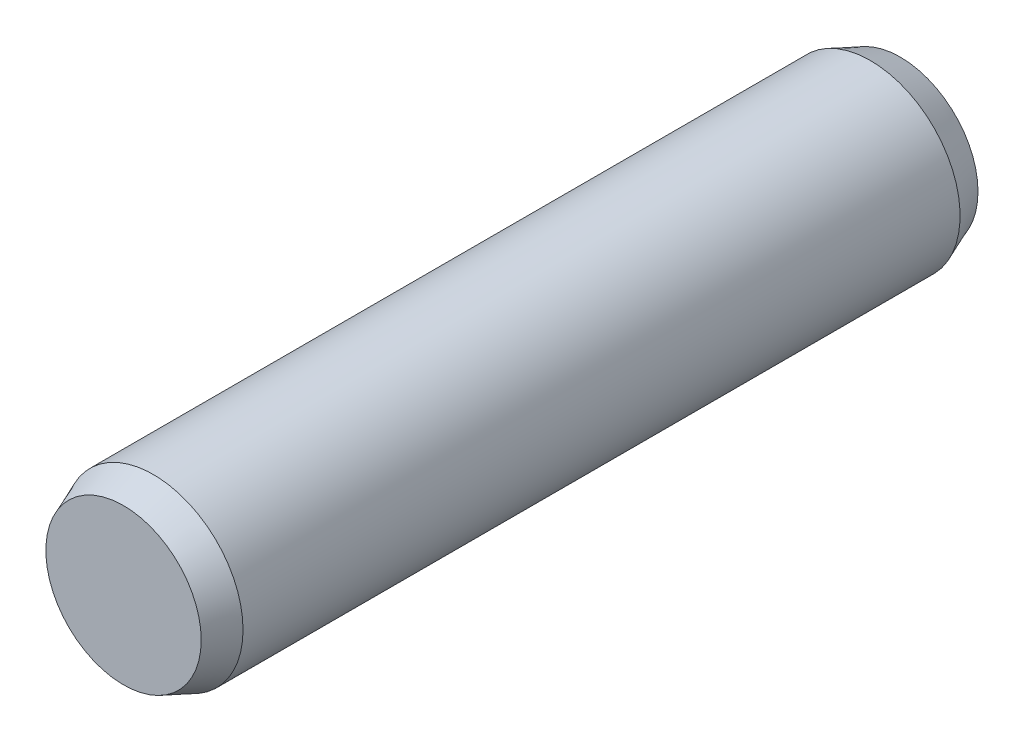
ISO-10303-21;
HEADER;
FILE_DESCRIPTION(('STEP AP214'),'2;1');
FILE_NAME('part.step','',(''),(''),'','','');
FILE_SCHEMA(('AUTOMOTIVE_DESIGN { 1 0 10303 214 1 1 1 1 }'));
ENDSEC;
DATA;
#1=APPLICATION_CONTEXT('core data for automotive mechanical design processes');
#2=APPLICATION_PROTOCOL_DEFINITION('international standard','automotive_design',2000,#1);
#3=PRODUCT_CONTEXT('',#1,'mechanical');
#4=PRODUCT('Part','Part','',(#3));
#5=PRODUCT_RELATED_PRODUCT_CATEGORY('part','',(#4));
#6=PRODUCT_DEFINITION_FORMATION('','',#4);
#7=PRODUCT_DEFINITION_CONTEXT('part definition',#1,'design');
#8=PRODUCT_DEFINITION('design','',#6,#7);
#9=PRODUCT_DEFINITION_SHAPE('','',#8);
#10=(LENGTH_UNIT() NAMED_UNIT(*) SI_UNIT(.MILLI.,.METRE.));
#11=(NAMED_UNIT(*) PLANE_ANGLE_UNIT() SI_UNIT($,.RADIAN.));
#12=(NAMED_UNIT(*) SI_UNIT($,.STERADIAN.) SOLID_ANGLE_UNIT());
#13=UNCERTAINTY_MEASURE_WITH_UNIT(LENGTH_MEASURE(1.E-05),#10,'distance_accuracy_value','');
#14=(GEOMETRIC_REPRESENTATION_CONTEXT(3) GLOBAL_UNCERTAINTY_ASSIGNED_CONTEXT((#13)) GLOBAL_UNIT_ASSIGNED_CONTEXT((#10,
#11,#12)) REPRESENTATION_CONTEXT('',''));
#15=CARTESIAN_POINT('',(0.,0.,0.));
#16=DIRECTION('',(0.,0.,1.));
#17=DIRECTION('',(1.,0.,0.));
#18=AXIS2_PLACEMENT_3D('',#15,#16,#17);
#19=CARTESIAN_POINT('',(0.,0.,-6.5));
#20=DIRECTION('',(0.,0.,1.));
#21=DIRECTION('',(-1.,0.,0.));
#22=AXIS2_PLACEMENT_3D('',#19,#20,#21);
#23=CYLINDRICAL_SURFACE('',#22,1.5);
#24=CARTESIAN_POINT('',(0.,0.,5.99999999999996));
#25=DIRECTION('',(0.,0.,1.));
#26=DIRECTION('',(1.,0.,0.));
#27=AXIS2_PLACEMENT_3D('',#24,#25,#26);
#28=CIRCLE('',#27,1.5);
#29=CARTESIAN_POINT('',(-1.5,0.,5.99999999999995));
#30=VERTEX_POINT('',#29);
#31=EDGE_CURVE('E48',#30,#30,#28,.T.);
#32=CARTESIAN_POINT('',(0.,0.,-6.00000000000001));
#33=DIRECTION('',(0.,0.,1.));
#34=DIRECTION('',(1.,0.,0.));
#35=AXIS2_PLACEMENT_3D('',#32,#33,#34);
#36=CIRCLE('',#35,1.5);
#37=CARTESIAN_POINT('',(-1.5,0.,-6.00000000000001));
#38=VERTEX_POINT('',#37);
#39=EDGE_CURVE('E52',#38,#38,#36,.F.);
#40=CARTESIAN_POINT('',(-1.5,0.,5.99999999999995));
#41=CARTESIAN_POINT('',(-1.5,0.,5.87499999999995));
#42=CARTESIAN_POINT('',(-1.5,0.,5.74999999999995));
#43=CARTESIAN_POINT('',(-1.5,0.,5.49999999999996));
#44=CARTESIAN_POINT('',(-1.5,0.,5.37499999999996));
#45=CARTESIAN_POINT('',(-1.5,0.,5.12499999999996));
#46=CARTESIAN_POINT('',(-1.5,0.,4.99999999999996));
#47=CARTESIAN_POINT('',(-1.5,0.,4.74999999999996));
#48=CARTESIAN_POINT('',(-1.5,0.,4.62499999999996));
#49=CARTESIAN_POINT('',(-1.5,0.,4.37499999999996));
#50=CARTESIAN_POINT('',(-1.5,0.,4.24999999999996));
#51=CARTESIAN_POINT('',(-1.5,0.,3.99999999999996));
#52=CARTESIAN_POINT('',(-1.5,0.,3.87499999999996));
#53=CARTESIAN_POINT('',(-1.5,0.,3.62499999999996));
#54=CARTESIAN_POINT('',(-1.5,0.,3.49999999999996));
#55=CARTESIAN_POINT('',(-1.5,0.,3.24999999999996));
#56=CARTESIAN_POINT('',(-1.5,0.,3.12499999999996));
#57=CARTESIAN_POINT('',(-1.5,0.,2.87499999999996));
#58=CARTESIAN_POINT('',(-1.5,0.,2.74999999999996));
#59=CARTESIAN_POINT('',(-1.5,0.,2.49999999999997));
#60=CARTESIAN_POINT('',(-1.5,0.,2.37499999999997));
#61=CARTESIAN_POINT('',(-1.5,0.,2.12499999999997));
#62=CARTESIAN_POINT('',(-1.5,0.,1.99999999999997));
#63=CARTESIAN_POINT('',(-1.5,0.,1.74999999999997));
#64=CARTESIAN_POINT('',(-1.5,0.,1.62499999999997));
#65=CARTESIAN_POINT('',(-1.5,0.,1.37499999999997));
#66=CARTESIAN_POINT('',(-1.5,0.,1.24999999999997));
#67=CARTESIAN_POINT('',(-1.5,0.,0.999999999999971));
#68=CARTESIAN_POINT('',(-1.5,0.,0.874999999999971));
#69=CARTESIAN_POINT('',(-1.5,0.,0.624999999999972));
#70=CARTESIAN_POINT('',(-1.5,0.,0.499999999999972));
#71=CARTESIAN_POINT('',(-1.5,0.,0.249999999999973));
#72=CARTESIAN_POINT('',(-1.5,0.,0.124999999999974));
#73=CARTESIAN_POINT('',(-1.5,0.,-0.125000000000026));
#74=CARTESIAN_POINT('',(-1.5,0.,-0.250000000000025));
#75=CARTESIAN_POINT('',(-1.5,0.,-0.500000000000024));
#76=CARTESIAN_POINT('',(-1.5,0.,-0.625000000000024));
#77=CARTESIAN_POINT('',(-1.5,0.,-0.875000000000023));
#78=CARTESIAN_POINT('',(-1.5,0.,-1.00000000000002));
#79=CARTESIAN_POINT('',(-1.5,0.,-1.25000000000002));
#80=CARTESIAN_POINT('',(-1.5,0.,-1.37500000000002));
#81=CARTESIAN_POINT('',(-1.5,0.,-1.62500000000002));
#82=CARTESIAN_POINT('',(-1.5,0.,-1.75000000000002));
#83=CARTESIAN_POINT('',(-1.5,0.,-2.00000000000002));
#84=CARTESIAN_POINT('',(-1.5,0.,-2.12500000000002));
#85=CARTESIAN_POINT('',(-1.5,0.,-2.37500000000002));
#86=CARTESIAN_POINT('',(-1.5,0.,-2.50000000000002));
#87=CARTESIAN_POINT('',(-1.5,0.,-2.75000000000002));
#88=CARTESIAN_POINT('',(-1.5,0.,-2.87500000000002));
#89=CARTESIAN_POINT('',(-1.5,0.,-3.12500000000002));
#90=CARTESIAN_POINT('',(-1.5,0.,-3.25000000000002));
#91=CARTESIAN_POINT('',(-1.5,0.,-3.50000000000001));
#92=CARTESIAN_POINT('',(-1.5,0.,-3.62500000000001));
#93=CARTESIAN_POINT('',(-1.5,0.,-3.87500000000001));
#94=CARTESIAN_POINT('',(-1.5,0.,-4.00000000000001));
#95=CARTESIAN_POINT('',(-1.5,0.,-4.25000000000001));
#96=CARTESIAN_POINT('',(-1.5,0.,-4.37500000000001));
#97=CARTESIAN_POINT('',(-1.5,0.,-4.62500000000001));
#98=CARTESIAN_POINT('',(-1.5,0.,-4.75000000000001));
#99=CARTESIAN_POINT('',(-1.5,0.,-5.00000000000001));
#100=CARTESIAN_POINT('',(-1.5,0.,-5.12500000000001));
#101=CARTESIAN_POINT('',(-1.5,0.,-5.37500000000001));
#102=CARTESIAN_POINT('',(-1.5,0.,-5.50000000000001));
#103=CARTESIAN_POINT('',(-1.5,0.,-5.75000000000001));
#104=CARTESIAN_POINT('',(-1.5,0.,-5.87500000000001));
#105=CARTESIAN_POINT('',(-1.5,0.,-6.00000000000001));
#106=B_SPLINE_CURVE_WITH_KNOTS('',3,(#40,#41,#42,#43,#44,#45,#46,#47,#48,#49,#50,#51,#52,#53,
#54,#55,#56,#57,#58,#59,#60,#61,#62,#63,#64,#65,#66,#67,#68,#69,#70,#71,#72,#73,#74,#75,#76,#77,
#78,#79,#80,#81,#82,#83,#84,#85,#86,#87,#88,#89,#90,#91,#92,#93,#94,#95,#96,#97,#98,#99,#100,
#101,#102,#103,#104,#105),.UNSPECIFIED.,.F.,.F.,(4,2,2,2,2,2,2,2,2,2,2,2,2,2,2,2,2,2,2,2,2,2,2,
2,2,2,2,2,2,2,2,2,4),(0.,0.374999999999999,0.749999999999997,1.125,1.49999999999999,
1.87499999999999,2.24999999999999,2.62499999999999,2.99999999999999,3.37499999999999,
3.74999999999999,4.12499999999999,4.49999999999999,4.87499999999998,5.24999999999998,
5.62499999999998,5.99999999999998,6.37499999999998,6.74999999999998,7.12499999999998,
7.49999999999998,7.87499999999998,8.24999999999998,8.62499999999997,8.99999999999997,
9.37499999999997,9.74999999999997,10.125,10.5,10.875,11.25,11.625,12.),.UNSPECIFIED.);
#107=EDGE_CURVE('BSEAM41',#30,#38,#106,.T.);
#108=ORIENTED_EDGE('',*,*,#31,.F.);
#109=ORIENTED_EDGE('',*,*,#39,.F.);
#110=ORIENTED_EDGE('',*,*,#107,.T.);
#111=ORIENTED_EDGE('',*,*,#107,.F.);
#112=EDGE_LOOP('',(#108,#110,#109,#111));
#113=FACE_BOUND('',#112,.T.);
#114=ADVANCED_FACE('F41',(#113),#23,.T.);
#115=CARTESIAN_POINT('',(0.,0.,-6.5));
#116=DIRECTION('',(0.,0.,-1.));
#117=DIRECTION('',(1.,0.,0.));
#118=AXIS2_PLACEMENT_3D('',#115,#116,#117);
#119=PLANE('',#118);
#120=CARTESIAN_POINT('',(0.,0.,-6.5));
#121=DIRECTION('',(0.,0.,1.));
#122=DIRECTION('',(1.,0.,0.));
#123=AXIS2_PLACEMENT_3D('',#120,#121,#122);
#124=CIRCLE('',#123,1.3);
#125=CARTESIAN_POINT('',(1.3,0.,-6.5));
#126=VERTEX_POINT('',#125);
#127=EDGE_CURVE('E56',#126,#126,#124,.T.);
#128=ORIENTED_EDGE('',*,*,#127,.F.);
#129=EDGE_LOOP('',(#128));
#130=FACE_BOUND('',#129,.T.);
#131=ADVANCED_FACE('F64',(#130),#119,.T.);
#132=CARTESIAN_POINT('',(0.,0.,6.5));
#133=DIRECTION('',(0.,0.,-1.));
#134=DIRECTION('',(1.,0.,0.));
#135=AXIS2_PLACEMENT_3D('',#132,#133,#134);
#136=PLANE('',#135);
#137=CARTESIAN_POINT('',(0.,0.,6.5));
#138=DIRECTION('',(0.,0.,1.));
#139=DIRECTION('',(1.,0.,0.));
#140=AXIS2_PLACEMENT_3D('',#137,#138,#139);
#141=CIRCLE('',#140,1.29999999999998);
#142=CARTESIAN_POINT('',(1.29999999999998,0.,6.5));
#143=VERTEX_POINT('',#142);
#144=EDGE_CURVE('E10',#143,#143,#141,.F.);
#145=ORIENTED_EDGE('',*,*,#144,.F.);
#146=EDGE_LOOP('',(#145));
#147=FACE_BOUND('',#146,.T.);
#148=ADVANCED_FACE('F66',(#147),#136,.F.);
#149=CARTESIAN_POINT('',(0.,0.,-6.5));
#150=DIRECTION('',(0.,0.,1.));
#151=DIRECTION('',(-1.,0.,0.));
#152=AXIS2_PLACEMENT_3D('',#149,#150,#151);
#153=CONICAL_SURFACE('',#152,1.3,0.380506377112362);
#154=ORIENTED_EDGE('',*,*,#39,.T.);
#155=EDGE_LOOP('',(#154));
#156=FACE_BOUND('',#155,.T.);
#157=ORIENTED_EDGE('',*,*,#127,.T.);
#158=EDGE_LOOP('',(#157));
#159=FACE_BOUND('',#158,.T.);
#160=ADVANCED_FACE('F62',(#156,#159),#153,.T.);
#161=CARTESIAN_POINT('',(0.,0.,5.99999999999996));
#162=DIRECTION('',(0.,0.,-1.));
#163=DIRECTION('',(1.,0.,0.));
#164=AXIS2_PLACEMENT_3D('',#161,#162,#163);
#165=CONICAL_SURFACE('',#164,1.5,0.380506377112365);
#166=ORIENTED_EDGE('',*,*,#144,.T.);
#167=EDGE_LOOP('',(#166));
#168=FACE_BOUND('',#167,.T.);
#169=ORIENTED_EDGE('',*,*,#31,.T.);
#170=EDGE_LOOP('',(#169));
#171=FACE_BOUND('',#170,.T.);
#172=ADVANCED_FACE('F43',(#168,#171),#165,.T.);
#173=CLOSED_SHELL('',(#114,#131,#148,#160,#172));
#174=MANIFOLD_SOLID_BREP('B2',#173);
#175=ADVANCED_BREP_SHAPE_REPRESENTATION('',(#18,#174),#14);
#176=SHAPE_DEFINITION_REPRESENTATION(#9,#175);
ENDSEC;
END-ISO-10303-21;
